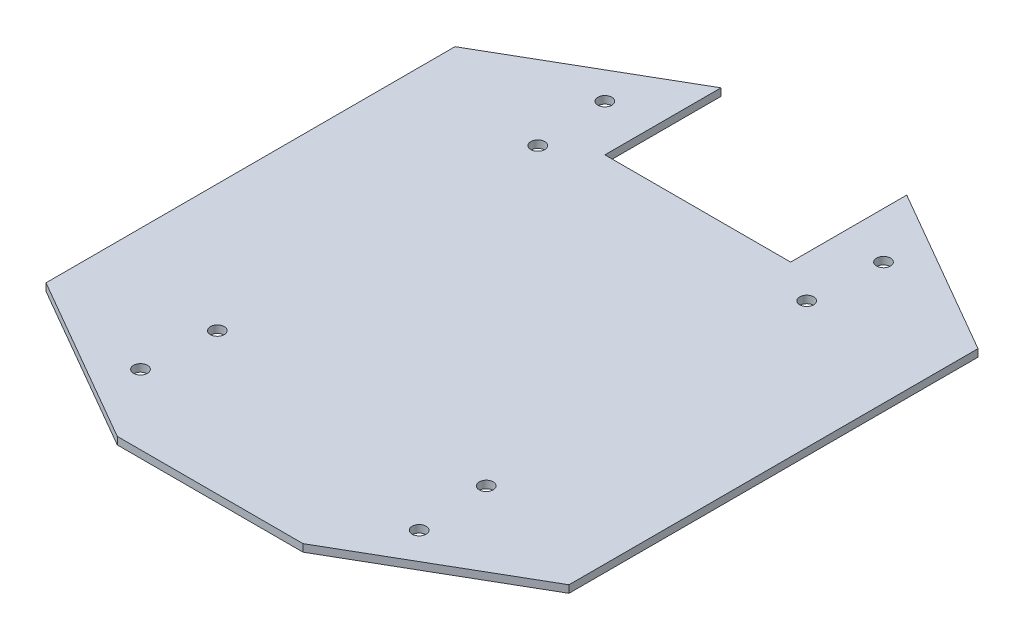
ISO-10303-21;
HEADER;
FILE_DESCRIPTION(('STEP AP214'),'2;1');
FILE_NAME('part.step','',(''),(''),'','','');
FILE_SCHEMA(('AUTOMOTIVE_DESIGN { 1 0 10303 214 1 1 1 1 }'));
ENDSEC;
DATA;
#1=APPLICATION_CONTEXT('core data for automotive mechanical design processes');
#2=APPLICATION_PROTOCOL_DEFINITION('international standard','automotive_design',2000,#1);
#3=PRODUCT_CONTEXT('',#1,'mechanical');
#4=PRODUCT('Part','Part','',(#3));
#5=PRODUCT_RELATED_PRODUCT_CATEGORY('part','',(#4));
#6=PRODUCT_DEFINITION_FORMATION('','',#4);
#7=PRODUCT_DEFINITION_CONTEXT('part definition',#1,'design');
#8=PRODUCT_DEFINITION('design','',#6,#7);
#9=PRODUCT_DEFINITION_SHAPE('','',#8);
#10=(LENGTH_UNIT() NAMED_UNIT(*) SI_UNIT(.MILLI.,.METRE.));
#11=(NAMED_UNIT(*) PLANE_ANGLE_UNIT() SI_UNIT($,.RADIAN.));
#12=(NAMED_UNIT(*) SI_UNIT($,.STERADIAN.) SOLID_ANGLE_UNIT());
#13=UNCERTAINTY_MEASURE_WITH_UNIT(LENGTH_MEASURE(1.E-05),#10,'distance_accuracy_value','');
#14=(GEOMETRIC_REPRESENTATION_CONTEXT(3) GLOBAL_UNCERTAINTY_ASSIGNED_CONTEXT((#13)) GLOBAL_UNIT_ASSIGNED_CONTEXT((#10,
#11,#12)) REPRESENTATION_CONTEXT('',''));
#15=CARTESIAN_POINT('',(0.,0.,0.));
#16=DIRECTION('',(0.,0.,1.));
#17=DIRECTION('',(1.,0.,0.));
#18=AXIS2_PLACEMENT_3D('',#15,#16,#17);
#19=CARTESIAN_POINT('',(20.,1.6,65.));
#20=DIRECTION('',(-0.500000000000001,0.,-0.866025403784438));
#21=DIRECTION('',(-0.866025403784438,0.,0.500000000000001));
#22=AXIS2_PLACEMENT_3D('',#19,#20,#21);
#23=PLANE('',#22);
#24=DIRECTION('',(0.866025403784438,0.,-0.500000000000001));
#25=VECTOR('',#24,1.);
#26=CARTESIAN_POINT('',(20.,0.,65.));
#27=LINE('',#26,#25);
#28=CARTESIAN_POINT('',(20.,0.,65.));
#29=VERTEX_POINT('',#28);
#30=CARTESIAN_POINT('',(56.3110248085631,0.,44.0358200522248));
#31=VERTEX_POINT('',#30);
#32=EDGE_CURVE('E155',#29,#31,#27,.T.);
#33=ORIENTED_EDGE('',*,*,#32,.T.);
#34=DIRECTION('',(0.,1.,0.));
#35=VECTOR('',#34,1.);
#36=CARTESIAN_POINT('',(56.3110248085631,-88.8853969484736,44.0358200522249));
#37=LINE('',#36,#35);
#38=CARTESIAN_POINT('',(56.3110248085631,1.6,44.0358200522249));
#39=VERTEX_POINT('',#38);
#40=EDGE_CURVE('E68',#31,#39,#37,.T.);
#41=ORIENTED_EDGE('',*,*,#40,.T.);
#42=DIRECTION('',(0.866025403784438,0.,-0.500000000000001));
#43=VECTOR('',#42,1.);
#44=CARTESIAN_POINT('',(20.,1.6,65.));
#45=LINE('',#44,#43);
#46=CARTESIAN_POINT('',(20.,1.6,65.));
#47=VERTEX_POINT('',#46);
#48=EDGE_CURVE('E149',#47,#39,#45,.T.);
#49=ORIENTED_EDGE('',*,*,#48,.F.);
#50=DIRECTION('',(0.,-1.,0.));
#51=VECTOR('',#50,1.);
#52=CARTESIAN_POINT('',(20.,1.6,65.));
#53=LINE('',#52,#51);
#54=EDGE_CURVE('E154',#47,#29,#53,.T.);
#55=ORIENTED_EDGE('',*,*,#54,.T.);
#56=EDGE_LOOP('',(#33,#41,#49,#55));
#57=FACE_BOUND('',#56,.T.);
#58=ADVANCED_FACE('F46',(#57),#23,.F.);
#59=CARTESIAN_POINT('',(20.,1.6,-65.));
#60=DIRECTION('',(-0.500000000000001,0.,0.866025403784438));
#61=DIRECTION('',(0.866025403784438,0.,0.500000000000001));
#62=AXIS2_PLACEMENT_3D('',#59,#60,#61);
#63=PLANE('',#62);
#64=DIRECTION('',(-0.866025403784438,0.,-0.500000000000001));
#65=VECTOR('',#64,1.);
#66=CARTESIAN_POINT('',(20.,1.6,-65.));
#67=LINE('',#66,#65);
#68=CARTESIAN_POINT('',(56.3110248085632,1.6,-44.0358200522249));
#69=VERTEX_POINT('',#68);
#70=CARTESIAN_POINT('',(20.,1.6,-65.));
#71=VERTEX_POINT('',#70);
#72=EDGE_CURVE('E145',#69,#71,#67,.T.);
#73=ORIENTED_EDGE('',*,*,#72,.F.);
#74=DIRECTION('',(0.,1.,0.));
#75=VECTOR('',#74,1.);
#76=CARTESIAN_POINT('',(56.3110248085632,-88.8853969484736,-44.0358200522249));
#77=LINE('',#76,#75);
#78=CARTESIAN_POINT('',(56.3110248085632,0.,-44.0358200522249));
#79=VERTEX_POINT('',#78);
#80=EDGE_CURVE('E182',#79,#69,#77,.T.);
#81=ORIENTED_EDGE('',*,*,#80,.F.);
#82=DIRECTION('',(-0.866025403784438,0.,-0.500000000000001));
#83=VECTOR('',#82,1.);
#84=CARTESIAN_POINT('',(20.,0.,-65.));
#85=LINE('',#84,#83);
#86=CARTESIAN_POINT('',(20.,0.,-65.));
#87=VERTEX_POINT('',#86);
#88=EDGE_CURVE('E158',#79,#87,#85,.T.);
#89=ORIENTED_EDGE('',*,*,#88,.T.);
#90=DIRECTION('',(0.,-1.,0.));
#91=VECTOR('',#90,1.);
#92=CARTESIAN_POINT('',(20.,1.6,-65.));
#93=LINE('',#92,#91);
#94=EDGE_CURVE('E11',#71,#87,#93,.T.);
#95=ORIENTED_EDGE('',*,*,#94,.F.);
#96=EDGE_LOOP('',(#73,#81,#89,#95));
#97=FACE_BOUND('',#96,.T.);
#98=ADVANCED_FACE('F263',(#97),#63,.F.);
#99=CARTESIAN_POINT('',(-20.,1.6,-65.));
#100=DIRECTION('',(0.499999999999995,0.,0.866025403784441));
#101=DIRECTION('',(0.866025403784442,0.,-0.499999999999995));
#102=AXIS2_PLACEMENT_3D('',#99,#100,#101);
#103=PLANE('',#102);
#104=DIRECTION('',(-0.866025403784441,0.,0.499999999999995));
#105=VECTOR('',#104,1.);
#106=CARTESIAN_POINT('',(-20.,0.,-65.));
#107=LINE('',#106,#105);
#108=CARTESIAN_POINT('',(-20.,0.,-65.));
#109=VERTEX_POINT('',#108);
#110=CARTESIAN_POINT('',(-56.3110248085633,0.,-44.0358200522251));
#111=VERTEX_POINT('',#110);
#112=EDGE_CURVE('E136',#109,#111,#107,.T.);
#113=ORIENTED_EDGE('',*,*,#112,.T.);
#114=DIRECTION('',(0.,1.,0.));
#115=VECTOR('',#114,1.);
#116=CARTESIAN_POINT('',(-56.3110248085632,-88.8853969484736,-44.0358200522249));
#117=LINE('',#116,#115);
#118=CARTESIAN_POINT('',(-56.3110248085632,1.6,-44.0358200522249));
#119=VERTEX_POINT('',#118);
#120=EDGE_CURVE('E60',#111,#119,#117,.T.);
#121=ORIENTED_EDGE('',*,*,#120,.T.);
#122=DIRECTION('',(-0.866025403784441,0.,0.499999999999995));
#123=VECTOR('',#122,1.);
#124=CARTESIAN_POINT('',(-20.,1.6,-65.));
#125=LINE('',#124,#123);
#126=CARTESIAN_POINT('',(-20.,1.6,-65.));
#127=VERTEX_POINT('',#126);
#128=EDGE_CURVE('E134',#127,#119,#125,.T.);
#129=ORIENTED_EDGE('',*,*,#128,.F.);
#130=DIRECTION('',(0.,-1.,0.));
#131=VECTOR('',#130,1.);
#132=CARTESIAN_POINT('',(-20.,1.6,-65.));
#133=LINE('',#132,#131);
#134=EDGE_CURVE('E53',#127,#109,#133,.T.);
#135=ORIENTED_EDGE('',*,*,#134,.T.);
#136=EDGE_LOOP('',(#113,#121,#129,#135));
#137=FACE_BOUND('',#136,.T.);
#138=ADVANCED_FACE('F132',(#137),#103,.F.);
#139=CARTESIAN_POINT('',(-20.,1.6,65.));
#140=DIRECTION('',(0.499999999999995,0.,-0.866025403784442));
#141=DIRECTION('',(-0.866025403784442,0.,-0.499999999999995));
#142=AXIS2_PLACEMENT_3D('',#139,#140,#141);
#143=PLANE('',#142);
#144=DIRECTION('',(0.866025403784442,0.,0.499999999999995));
#145=VECTOR('',#144,1.);
#146=CARTESIAN_POINT('',(-20.,1.6,65.));
#147=LINE('',#146,#145);
#148=CARTESIAN_POINT('',(-56.3110248085631,1.6,44.0358200522249));
#149=VERTEX_POINT('',#148);
#150=CARTESIAN_POINT('',(-20.,1.6,65.));
#151=VERTEX_POINT('',#150);
#152=EDGE_CURVE('E144',#149,#151,#147,.T.);
#153=ORIENTED_EDGE('',*,*,#152,.F.);
#154=DIRECTION('',(0.,1.,0.));
#155=VECTOR('',#154,1.);
#156=CARTESIAN_POINT('',(-56.3110248085631,-88.8853969484736,44.0358200522249));
#157=LINE('',#156,#155);
#158=CARTESIAN_POINT('',(-56.3110248085631,0.,44.0358200522249));
#159=VERTEX_POINT('',#158);
#160=EDGE_CURVE('E123',#159,#149,#157,.T.);
#161=ORIENTED_EDGE('',*,*,#160,.F.);
#162=DIRECTION('',(0.866025403784442,0.,0.499999999999995));
#163=VECTOR('',#162,1.);
#164=CARTESIAN_POINT('',(-20.,0.,65.));
#165=LINE('',#164,#163);
#166=CARTESIAN_POINT('',(-20.,0.,65.));
#167=VERTEX_POINT('',#166);
#168=EDGE_CURVE('E162',#159,#167,#165,.T.);
#169=ORIENTED_EDGE('',*,*,#168,.T.);
#170=DIRECTION('',(0.,-1.,0.));
#171=VECTOR('',#170,1.);
#172=CARTESIAN_POINT('',(-20.,1.6,65.));
#173=LINE('',#172,#171);
#174=EDGE_CURVE('E168',#151,#167,#173,.T.);
#175=ORIENTED_EDGE('',*,*,#174,.F.);
#176=EDGE_LOOP('',(#153,#161,#169,#175));
#177=FACE_BOUND('',#176,.T.);
#178=ADVANCED_FACE('F293',(#177),#143,.F.);
#179=CARTESIAN_POINT('',(-20.,1.6,65.));
#180=DIRECTION('',(0.,0.,-1.));
#181=DIRECTION('',(-1.,0.,0.));
#182=AXIS2_PLACEMENT_3D('',#179,#180,#181);
#183=PLANE('',#182);
#184=DIRECTION('',(1.,0.,0.));
#185=VECTOR('',#184,1.);
#186=CARTESIAN_POINT('',(-20.,0.,65.));
#187=LINE('',#186,#185);
#188=EDGE_CURVE('E164',#167,#29,#187,.T.);
#189=ORIENTED_EDGE('',*,*,#188,.T.);
#190=ORIENTED_EDGE('',*,*,#54,.F.);
#191=DIRECTION('',(1.,0.,0.));
#192=VECTOR('',#191,1.);
#193=CARTESIAN_POINT('',(-20.,1.6,65.));
#194=LINE('',#193,#192);
#195=EDGE_CURVE('E147',#151,#47,#194,.T.);
#196=ORIENTED_EDGE('',*,*,#195,.F.);
#197=ORIENTED_EDGE('',*,*,#174,.T.);
#198=EDGE_LOOP('',(#189,#190,#196,#197));
#199=FACE_BOUND('',#198,.T.);
#200=ADVANCED_FACE('F298',(#199),#183,.F.);
#201=CARTESIAN_POINT('',(0.,1.6,0.));
#202=DIRECTION('',(0.,-1.,0.));
#203=DIRECTION('',(0.,0.,-1.));
#204=AXIS2_PLACEMENT_3D('',#201,#202,#203);
#205=PLANE('',#204);
#206=CARTESIAN_POINT('',(28.953010595,1.6,-34.50485439));
#207=DIRECTION('',(0.,1.,0.));
#208=DIRECTION('',(0.,0.,1.));
#209=AXIS2_PLACEMENT_3D('',#206,#207,#208);
#210=CIRCLE('',#209,1.5);
#211=CARTESIAN_POINT('',(28.953010595,1.6,-33.00485439));
#212=VERTEX_POINT('',#211);
#213=EDGE_CURVE('E215',#212,#212,#210,.T.);
#214=ORIENTED_EDGE('',*,*,#213,.F.);
#215=EDGE_LOOP('',(#214));
#216=FACE_BOUND('',#215,.T.);
#217=CARTESIAN_POINT('',(-28.953010595,1.6,34.50485439));
#218=DIRECTION('',(0.,1.,0.));
#219=DIRECTION('',(0.,0.,1.));
#220=AXIS2_PLACEMENT_3D('',#217,#218,#219);
#221=CIRCLE('',#220,1.5);
#222=CARTESIAN_POINT('',(-28.953010595,1.6,36.00485439));
#223=VERTEX_POINT('',#222);
#224=EDGE_CURVE('E216',#223,#223,#221,.T.);
#225=ORIENTED_EDGE('',*,*,#224,.F.);
#226=EDGE_LOOP('',(#225));
#227=FACE_BOUND('',#226,.T.);
#228=CARTESIAN_POINT('',(28.953010595,1.6,34.50485439));
#229=DIRECTION('',(0.,1.,0.));
#230=DIRECTION('',(0.,0.,1.));
#231=AXIS2_PLACEMENT_3D('',#228,#229,#230);
#232=CIRCLE('',#231,1.5);
#233=CARTESIAN_POINT('',(28.953010595,1.6,36.00485439));
#234=VERTEX_POINT('',#233);
#235=EDGE_CURVE('E208',#234,#234,#232,.T.);
#236=ORIENTED_EDGE('',*,*,#235,.F.);
#237=EDGE_LOOP('',(#236));
#238=FACE_BOUND('',#237,.T.);
#239=CARTESIAN_POINT('',(-28.953010595,1.6,-34.50485439));
#240=DIRECTION('',(0.,1.,0.));
#241=DIRECTION('',(0.,0.,1.));
#242=AXIS2_PLACEMENT_3D('',#239,#240,#241);
#243=CIRCLE('',#242,1.5);
#244=CARTESIAN_POINT('',(-28.953010595,1.6,-33.00485439));
#245=VERTEX_POINT('',#244);
#246=EDGE_CURVE('E219',#245,#245,#243,.T.);
#247=ORIENTED_EDGE('',*,*,#246,.F.);
#248=EDGE_LOOP('',(#247));
#249=FACE_BOUND('',#248,.T.);
#250=CARTESIAN_POINT('',(-30.,1.6,50.));
#251=DIRECTION('',(0.,1.,0.));
#252=DIRECTION('',(0.,0.,1.));
#253=AXIS2_PLACEMENT_3D('',#250,#251,#252);
#254=CIRCLE('',#253,1.5);
#255=CARTESIAN_POINT('',(-30.,1.6,51.5));
#256=VERTEX_POINT('',#255);
#257=EDGE_CURVE('E241',#256,#256,#254,.T.);
#258=ORIENTED_EDGE('',*,*,#257,.F.);
#259=EDGE_LOOP('',(#258));
#260=FACE_BOUND('',#259,.T.);
#261=CARTESIAN_POINT('',(30.,1.6,50.));
#262=DIRECTION('',(0.,1.,0.));
#263=DIRECTION('',(0.,0.,1.));
#264=AXIS2_PLACEMENT_3D('',#261,#262,#263);
#265=CIRCLE('',#264,1.50000000000002);
#266=CARTESIAN_POINT('',(30.,1.6,51.5));
#267=VERTEX_POINT('',#266);
#268=EDGE_CURVE('E234',#267,#267,#265,.T.);
#269=ORIENTED_EDGE('',*,*,#268,.F.);
#270=EDGE_LOOP('',(#269));
#271=FACE_BOUND('',#270,.T.);
#272=CARTESIAN_POINT('',(30.,1.6,-50.));
#273=DIRECTION('',(0.,1.,0.));
#274=DIRECTION('',(0.,0.,1.));
#275=AXIS2_PLACEMENT_3D('',#272,#273,#274);
#276=CIRCLE('',#275,1.50000000000002);
#277=CARTESIAN_POINT('',(30.,1.6,-48.5));
#278=VERTEX_POINT('',#277);
#279=EDGE_CURVE('E233',#278,#278,#276,.T.);
#280=ORIENTED_EDGE('',*,*,#279,.F.);
#281=EDGE_LOOP('',(#280));
#282=FACE_BOUND('',#281,.T.);
#283=CARTESIAN_POINT('',(-30.,1.6,-50.));
#284=DIRECTION('',(0.,1.,0.));
#285=DIRECTION('',(0.,0.,1.));
#286=AXIS2_PLACEMENT_3D('',#283,#284,#285);
#287=CIRCLE('',#286,1.5);
#288=CARTESIAN_POINT('',(-30.,1.6,-48.5));
#289=VERTEX_POINT('',#288);
#290=EDGE_CURVE('E237',#289,#289,#287,.T.);
#291=ORIENTED_EDGE('',*,*,#290,.F.);
#292=EDGE_LOOP('',(#291));
#293=FACE_BOUND('',#292,.T.);
#294=ORIENTED_EDGE('',*,*,#128,.T.);
#295=DIRECTION('',(0.,0.,-1.));
#296=VECTOR('',#295,1.);
#297=CARTESIAN_POINT('',(-56.3110248085632,1.6,-44.0358200522249));
#298=LINE('',#297,#296);
#299=EDGE_CURVE('E120',#149,#119,#298,.T.);
#300=ORIENTED_EDGE('',*,*,#299,.F.);
#301=ORIENTED_EDGE('',*,*,#152,.T.);
#302=ORIENTED_EDGE('',*,*,#195,.T.);
#303=ORIENTED_EDGE('',*,*,#48,.T.);
#304=DIRECTION('',(0.,0.,1.));
#305=VECTOR('',#304,1.);
#306=CARTESIAN_POINT('',(56.3110248085632,1.6,-44.0358200522249));
#307=LINE('',#306,#305);
#308=EDGE_CURVE('E127',#69,#39,#307,.T.);
#309=ORIENTED_EDGE('',*,*,#308,.F.);
#310=ORIENTED_EDGE('',*,*,#72,.T.);
#311=DIRECTION('',(0.,0.,-1.));
#312=VECTOR('',#311,1.);
#313=CARTESIAN_POINT('',(20.,1.6,-40.));
#314=LINE('',#313,#312);
#315=CARTESIAN_POINT('',(20.,1.6,-40.));
#316=VERTEX_POINT('',#315);
#317=EDGE_CURVE('E188',#316,#71,#314,.T.);
#318=ORIENTED_EDGE('',*,*,#317,.F.);
#319=DIRECTION('',(1.,0.,0.));
#320=VECTOR('',#319,1.);
#321=CARTESIAN_POINT('',(-20.,1.6,-40.));
#322=LINE('',#321,#320);
#323=CARTESIAN_POINT('',(-20.,1.6,-40.));
#324=VERTEX_POINT('',#323);
#325=EDGE_CURVE('E191',#324,#316,#322,.T.);
#326=ORIENTED_EDGE('',*,*,#325,.F.);
#327=DIRECTION('',(0.,0.,1.));
#328=VECTOR('',#327,1.);
#329=CARTESIAN_POINT('',(-20.,1.6,-65.));
#330=LINE('',#329,#328);
#331=EDGE_CURVE('E137',#127,#324,#330,.T.);
#332=ORIENTED_EDGE('',*,*,#331,.F.);
#333=EDGE_LOOP('',(#294,#300,#301,#302,#303,#309,#310,#318,#326,#332));
#334=FACE_BOUND('',#333,.T.);
#335=ADVANCED_FACE('F141',(#216,#227,#238,#249,#260,#271,#282,#293,#334),#205,.F.);
#336=CARTESIAN_POINT('',(0.,0.,0.));
#337=DIRECTION('',(0.,-1.,0.));
#338=DIRECTION('',(0.,0.,-1.));
#339=AXIS2_PLACEMENT_3D('',#336,#337,#338);
#340=PLANE('',#339);
#341=DIRECTION('',(0.,0.,-1.));
#342=VECTOR('',#341,1.);
#343=CARTESIAN_POINT('',(-56.3110248085632,0.,-44.0358200522249));
#344=LINE('',#343,#342);
#345=EDGE_CURVE('E138',#159,#111,#344,.T.);
#346=ORIENTED_EDGE('',*,*,#345,.T.);
#347=ORIENTED_EDGE('',*,*,#112,.F.);
#348=DIRECTION('',(0.,0.,1.));
#349=VECTOR('',#348,1.);
#350=CARTESIAN_POINT('',(-20.,0.,-65.));
#351=LINE('',#350,#349);
#352=CARTESIAN_POINT('',(-20.,0.,-40.));
#353=VERTEX_POINT('',#352);
#354=EDGE_CURVE('E176',#109,#353,#351,.T.);
#355=ORIENTED_EDGE('',*,*,#354,.T.);
#356=DIRECTION('',(1.,0.,0.));
#357=VECTOR('',#356,1.);
#358=CARTESIAN_POINT('',(-20.,0.,-40.));
#359=LINE('',#358,#357);
#360=CARTESIAN_POINT('',(20.,0.,-40.));
#361=VERTEX_POINT('',#360);
#362=EDGE_CURVE('E202',#353,#361,#359,.T.);
#363=ORIENTED_EDGE('',*,*,#362,.T.);
#364=DIRECTION('',(0.,0.,-1.));
#365=VECTOR('',#364,1.);
#366=CARTESIAN_POINT('',(20.,0.,-40.));
#367=LINE('',#366,#365);
#368=EDGE_CURVE('E197',#361,#87,#367,.T.);
#369=ORIENTED_EDGE('',*,*,#368,.T.);
#370=ORIENTED_EDGE('',*,*,#88,.F.);
#371=DIRECTION('',(0.,0.,1.));
#372=VECTOR('',#371,1.);
#373=CARTESIAN_POINT('',(56.3110248085632,0.,-44.0358200522249));
#374=LINE('',#373,#372);
#375=EDGE_CURVE('E184',#79,#31,#374,.T.);
#376=ORIENTED_EDGE('',*,*,#375,.T.);
#377=ORIENTED_EDGE('',*,*,#32,.F.);
#378=ORIENTED_EDGE('',*,*,#188,.F.);
#379=ORIENTED_EDGE('',*,*,#168,.F.);
#380=EDGE_LOOP('',(#346,#347,#355,#363,#369,#370,#376,#377,#378,#379));
#381=FACE_BOUND('',#380,.T.);
#382=CARTESIAN_POINT('',(28.953010595,0.,-34.50485439));
#383=DIRECTION('',(0.,-1.,0.));
#384=DIRECTION('',(0.,0.,-1.));
#385=AXIS2_PLACEMENT_3D('',#382,#383,#384);
#386=CIRCLE('',#385,1.5);
#387=CARTESIAN_POINT('',(28.953010595,0.,-36.00485439));
#388=VERTEX_POINT('',#387);
#389=EDGE_CURVE('E212',#388,#388,#386,.F.);
#390=ORIENTED_EDGE('',*,*,#389,.T.);
#391=EDGE_LOOP('',(#390));
#392=FACE_BOUND('',#391,.T.);
#393=CARTESIAN_POINT('',(-28.953010595,0.,34.50485439));
#394=DIRECTION('',(0.,-1.,0.));
#395=DIRECTION('',(0.,0.,-1.));
#396=AXIS2_PLACEMENT_3D('',#393,#394,#395);
#397=CIRCLE('',#396,1.5);
#398=CARTESIAN_POINT('',(-28.953010595,0.,33.00485439));
#399=VERTEX_POINT('',#398);
#400=EDGE_CURVE('E211',#399,#399,#397,.F.);
#401=ORIENTED_EDGE('',*,*,#400,.T.);
#402=EDGE_LOOP('',(#401));
#403=FACE_BOUND('',#402,.T.);
#404=CARTESIAN_POINT('',(28.953010595,0.,34.50485439));
#405=DIRECTION('',(0.,-1.,0.));
#406=DIRECTION('',(0.,0.,-1.));
#407=AXIS2_PLACEMENT_3D('',#404,#405,#406);
#408=CIRCLE('',#407,1.5);
#409=CARTESIAN_POINT('',(28.953010595,0.,33.00485439));
#410=VERTEX_POINT('',#409);
#411=EDGE_CURVE('E200',#410,#410,#408,.F.);
#412=ORIENTED_EDGE('',*,*,#411,.T.);
#413=EDGE_LOOP('',(#412));
#414=FACE_BOUND('',#413,.T.);
#415=CARTESIAN_POINT('',(-28.953010595,0.,-34.50485439));
#416=DIRECTION('',(0.,-1.,0.));
#417=DIRECTION('',(0.,0.,-1.));
#418=AXIS2_PLACEMENT_3D('',#415,#416,#417);
#419=CIRCLE('',#418,1.5);
#420=CARTESIAN_POINT('',(-28.953010595,0.,-36.00485439));
#421=VERTEX_POINT('',#420);
#422=EDGE_CURVE('E226',#421,#421,#419,.F.);
#423=ORIENTED_EDGE('',*,*,#422,.T.);
#424=EDGE_LOOP('',(#423));
#425=FACE_BOUND('',#424,.T.);
#426=CARTESIAN_POINT('',(-30.,0.,50.));
#427=DIRECTION('',(0.,-1.,0.));
#428=DIRECTION('',(0.,0.,-1.));
#429=AXIS2_PLACEMENT_3D('',#426,#427,#428);
#430=CIRCLE('',#429,1.5);
#431=CARTESIAN_POINT('',(-30.,0.,48.5));
#432=VERTEX_POINT('',#431);
#433=EDGE_CURVE('E229',#432,#432,#430,.F.);
#434=ORIENTED_EDGE('',*,*,#433,.T.);
#435=EDGE_LOOP('',(#434));
#436=FACE_BOUND('',#435,.T.);
#437=CARTESIAN_POINT('',(30.,0.,50.));
#438=DIRECTION('',(0.,-1.,0.));
#439=DIRECTION('',(0.,0.,-1.));
#440=AXIS2_PLACEMENT_3D('',#437,#438,#439);
#441=CIRCLE('',#440,1.50000000000002);
#442=CARTESIAN_POINT('',(30.,0.,48.5));
#443=VERTEX_POINT('',#442);
#444=EDGE_CURVE('E238',#443,#443,#441,.F.);
#445=ORIENTED_EDGE('',*,*,#444,.T.);
#446=EDGE_LOOP('',(#445));
#447=FACE_BOUND('',#446,.T.);
#448=CARTESIAN_POINT('',(30.,0.,-50.));
#449=DIRECTION('',(0.,-1.,0.));
#450=DIRECTION('',(0.,0.,-1.));
#451=AXIS2_PLACEMENT_3D('',#448,#449,#450);
#452=CIRCLE('',#451,1.50000000000002);
#453=CARTESIAN_POINT('',(30.,0.,-51.5));
#454=VERTEX_POINT('',#453);
#455=EDGE_CURVE('E230',#454,#454,#452,.F.);
#456=ORIENTED_EDGE('',*,*,#455,.T.);
#457=EDGE_LOOP('',(#456));
#458=FACE_BOUND('',#457,.T.);
#459=CARTESIAN_POINT('',(-30.,0.,-50.));
#460=DIRECTION('',(0.,-1.,0.));
#461=DIRECTION('',(0.,0.,-1.));
#462=AXIS2_PLACEMENT_3D('',#459,#460,#461);
#463=CIRCLE('',#462,1.5);
#464=CARTESIAN_POINT('',(-30.,0.,-51.5));
#465=VERTEX_POINT('',#464);
#466=EDGE_CURVE('E159',#465,#465,#463,.F.);
#467=ORIENTED_EDGE('',*,*,#466,.T.);
#468=EDGE_LOOP('',(#467));
#469=FACE_BOUND('',#468,.T.);
#470=ADVANCED_FACE('F173',(#381,#392,#403,#414,#425,#436,#447,#458,#469),#340,.T.);
#471=CARTESIAN_POINT('',(-30.,-4.24264068711933,-50.));
#472=DIRECTION('',(0.,1.,0.));
#473=DIRECTION('',(0.,0.,1.));
#474=AXIS2_PLACEMENT_3D('',#471,#472,#473);
#475=CYLINDRICAL_SURFACE('',#474,1.5);
#476=ORIENTED_EDGE('',*,*,#290,.T.);
#477=EDGE_LOOP('',(#476));
#478=FACE_BOUND('',#477,.T.);
#479=ORIENTED_EDGE('',*,*,#466,.F.);
#480=EDGE_LOOP('',(#479));
#481=FACE_BOUND('',#480,.T.);
#482=ADVANCED_FACE('F305',(#478,#481),#475,.F.);
#483=CARTESIAN_POINT('',(30.,-4.24264068711933,-50.));
#484=DIRECTION('',(0.,1.,0.));
#485=DIRECTION('',(0.,0.,1.));
#486=AXIS2_PLACEMENT_3D('',#483,#484,#485);
#487=CYLINDRICAL_SURFACE('',#486,1.50000000000002);
#488=ORIENTED_EDGE('',*,*,#279,.T.);
#489=EDGE_LOOP('',(#488));
#490=FACE_BOUND('',#489,.T.);
#491=ORIENTED_EDGE('',*,*,#455,.F.);
#492=EDGE_LOOP('',(#491));
#493=FACE_BOUND('',#492,.T.);
#494=ADVANCED_FACE('F311',(#490,#493),#487,.F.);
#495=CARTESIAN_POINT('',(30.,-4.24264068711933,50.));
#496=DIRECTION('',(0.,1.,0.));
#497=DIRECTION('',(0.,0.,1.));
#498=AXIS2_PLACEMENT_3D('',#495,#496,#497);
#499=CYLINDRICAL_SURFACE('',#498,1.50000000000002);
#500=ORIENTED_EDGE('',*,*,#268,.T.);
#501=EDGE_LOOP('',(#500));
#502=FACE_BOUND('',#501,.T.);
#503=ORIENTED_EDGE('',*,*,#444,.F.);
#504=EDGE_LOOP('',(#503));
#505=FACE_BOUND('',#504,.T.);
#506=ADVANCED_FACE('F317',(#502,#505),#499,.F.);
#507=CARTESIAN_POINT('',(-30.,-4.24264068711933,50.));
#508=DIRECTION('',(0.,1.,0.));
#509=DIRECTION('',(0.,0.,1.));
#510=AXIS2_PLACEMENT_3D('',#507,#508,#509);
#511=CYLINDRICAL_SURFACE('',#510,1.5);
#512=ORIENTED_EDGE('',*,*,#257,.T.);
#513=EDGE_LOOP('',(#512));
#514=FACE_BOUND('',#513,.T.);
#515=ORIENTED_EDGE('',*,*,#433,.F.);
#516=EDGE_LOOP('',(#515));
#517=FACE_BOUND('',#516,.T.);
#518=ADVANCED_FACE('F313',(#514,#517),#511,.F.);
#519=CARTESIAN_POINT('',(-28.953010595,-4.24264068711929,-34.50485439));
#520=DIRECTION('',(0.,1.,0.));
#521=DIRECTION('',(0.,0.,1.));
#522=AXIS2_PLACEMENT_3D('',#519,#520,#521);
#523=CYLINDRICAL_SURFACE('',#522,1.5);
#524=ORIENTED_EDGE('',*,*,#246,.T.);
#525=EDGE_LOOP('',(#524));
#526=FACE_BOUND('',#525,.T.);
#527=ORIENTED_EDGE('',*,*,#422,.F.);
#528=EDGE_LOOP('',(#527));
#529=FACE_BOUND('',#528,.T.);
#530=ADVANCED_FACE('F316',(#526,#529),#523,.F.);
#531=CARTESIAN_POINT('',(28.953010595,-4.24264068711929,34.50485439));
#532=DIRECTION('',(0.,1.,0.));
#533=DIRECTION('',(0.,0.,1.));
#534=AXIS2_PLACEMENT_3D('',#531,#532,#533);
#535=CYLINDRICAL_SURFACE('',#534,1.5);
#536=ORIENTED_EDGE('',*,*,#235,.T.);
#537=EDGE_LOOP('',(#536));
#538=FACE_BOUND('',#537,.T.);
#539=ORIENTED_EDGE('',*,*,#411,.F.);
#540=EDGE_LOOP('',(#539));
#541=FACE_BOUND('',#540,.T.);
#542=ADVANCED_FACE('F327',(#538,#541),#535,.F.);
#543=CARTESIAN_POINT('',(-28.953010595,-4.24264068711929,34.50485439));
#544=DIRECTION('',(0.,1.,0.));
#545=DIRECTION('',(0.,0.,1.));
#546=AXIS2_PLACEMENT_3D('',#543,#544,#545);
#547=CYLINDRICAL_SURFACE('',#546,1.5);
#548=ORIENTED_EDGE('',*,*,#224,.T.);
#549=EDGE_LOOP('',(#548));
#550=FACE_BOUND('',#549,.T.);
#551=ORIENTED_EDGE('',*,*,#400,.F.);
#552=EDGE_LOOP('',(#551));
#553=FACE_BOUND('',#552,.T.);
#554=ADVANCED_FACE('F281',(#550,#553),#547,.F.);
#555=CARTESIAN_POINT('',(28.953010595,-4.24264068711929,-34.50485439));
#556=DIRECTION('',(0.,1.,0.));
#557=DIRECTION('',(0.,0.,1.));
#558=AXIS2_PLACEMENT_3D('',#555,#556,#557);
#559=CYLINDRICAL_SURFACE('',#558,1.5);
#560=ORIENTED_EDGE('',*,*,#213,.T.);
#561=EDGE_LOOP('',(#560));
#562=FACE_BOUND('',#561,.T.);
#563=ORIENTED_EDGE('',*,*,#389,.F.);
#564=EDGE_LOOP('',(#563));
#565=FACE_BOUND('',#564,.T.);
#566=ADVANCED_FACE('F274',(#562,#565),#559,.F.);
#567=CARTESIAN_POINT('',(-20.,-47.169905660283,-65.));
#568=DIRECTION('',(-1.,0.,0.));
#569=DIRECTION('',(0.,0.,1.));
#570=AXIS2_PLACEMENT_3D('',#567,#568,#569);
#571=PLANE('',#570);
#572=ORIENTED_EDGE('',*,*,#134,.F.);
#573=ORIENTED_EDGE('',*,*,#331,.T.);
#574=DIRECTION('',(0.,1.,0.));
#575=VECTOR('',#574,1.);
#576=CARTESIAN_POINT('',(-20.,-47.169905660283,-40.));
#577=LINE('',#576,#575);
#578=EDGE_CURVE('E196',#353,#324,#577,.T.);
#579=ORIENTED_EDGE('',*,*,#578,.F.);
#580=ORIENTED_EDGE('',*,*,#354,.F.);
#581=EDGE_LOOP('',(#572,#573,#579,#580));
#582=FACE_BOUND('',#581,.T.);
#583=ADVANCED_FACE('F272',(#582),#571,.F.);
#584=CARTESIAN_POINT('',(-20.,-47.169905660283,-40.));
#585=DIRECTION('',(0.,0.,1.));
#586=DIRECTION('',(1.,0.,0.));
#587=AXIS2_PLACEMENT_3D('',#584,#585,#586);
#588=PLANE('',#587);
#589=ORIENTED_EDGE('',*,*,#578,.T.);
#590=ORIENTED_EDGE('',*,*,#325,.T.);
#591=DIRECTION('',(0.,1.,0.));
#592=VECTOR('',#591,1.);
#593=CARTESIAN_POINT('',(20.,-47.169905660283,-40.));
#594=LINE('',#593,#592);
#595=EDGE_CURVE('E201',#361,#316,#594,.T.);
#596=ORIENTED_EDGE('',*,*,#595,.F.);
#597=ORIENTED_EDGE('',*,*,#362,.F.);
#598=EDGE_LOOP('',(#589,#590,#596,#597));
#599=FACE_BOUND('',#598,.T.);
#600=ADVANCED_FACE('F270',(#599),#588,.F.);
#601=CARTESIAN_POINT('',(20.,-47.169905660283,-40.));
#602=DIRECTION('',(1.,0.,0.));
#603=DIRECTION('',(0.,0.,-1.));
#604=AXIS2_PLACEMENT_3D('',#601,#602,#603);
#605=PLANE('',#604);
#606=ORIENTED_EDGE('',*,*,#595,.T.);
#607=ORIENTED_EDGE('',*,*,#317,.T.);
#608=ORIENTED_EDGE('',*,*,#94,.T.);
#609=ORIENTED_EDGE('',*,*,#368,.F.);
#610=EDGE_LOOP('',(#606,#607,#608,#609));
#611=FACE_BOUND('',#610,.T.);
#612=ADVANCED_FACE('F267',(#611),#605,.F.);
#613=CARTESIAN_POINT('',(56.3110248085632,-88.8853969484736,-44.0358200522249));
#614=DIRECTION('',(-1.,0.,0.));
#615=DIRECTION('',(0.,0.,1.));
#616=AXIS2_PLACEMENT_3D('',#613,#614,#615);
#617=PLANE('',#616);
#618=ORIENTED_EDGE('',*,*,#80,.T.);
#619=ORIENTED_EDGE('',*,*,#308,.T.);
#620=ORIENTED_EDGE('',*,*,#40,.F.);
#621=ORIENTED_EDGE('',*,*,#375,.F.);
#622=EDGE_LOOP('',(#618,#619,#620,#621));
#623=FACE_BOUND('',#622,.T.);
#624=ADVANCED_FACE('F261',(#623),#617,.F.);
#625=CARTESIAN_POINT('',(-56.3110248085632,-88.8853969484736,-44.0358200522249));
#626=DIRECTION('',(1.,0.,0.));
#627=DIRECTION('',(0.,0.,-1.));
#628=AXIS2_PLACEMENT_3D('',#625,#626,#627);
#629=PLANE('',#628);
#630=ORIENTED_EDGE('',*,*,#160,.T.);
#631=ORIENTED_EDGE('',*,*,#299,.T.);
#632=ORIENTED_EDGE('',*,*,#120,.F.);
#633=ORIENTED_EDGE('',*,*,#345,.F.);
#634=EDGE_LOOP('',(#630,#631,#632,#633));
#635=FACE_BOUND('',#634,.T.);
#636=ADVANCED_FACE('F121',(#635),#629,.F.);
#637=CLOSED_SHELL('',(#58,#98,#138,#178,#200,#335,#470,#482,#494,#506,#518,#530,#542,#554,#566,
#583,#600,#612,#624,#636));
#638=MANIFOLD_SOLID_BREP('B2',#637);
#639=ADVANCED_BREP_SHAPE_REPRESENTATION('',(#18,#638),#14);
#640=SHAPE_DEFINITION_REPRESENTATION(#9,#639);
ENDSEC;
END-ISO-10303-21;
